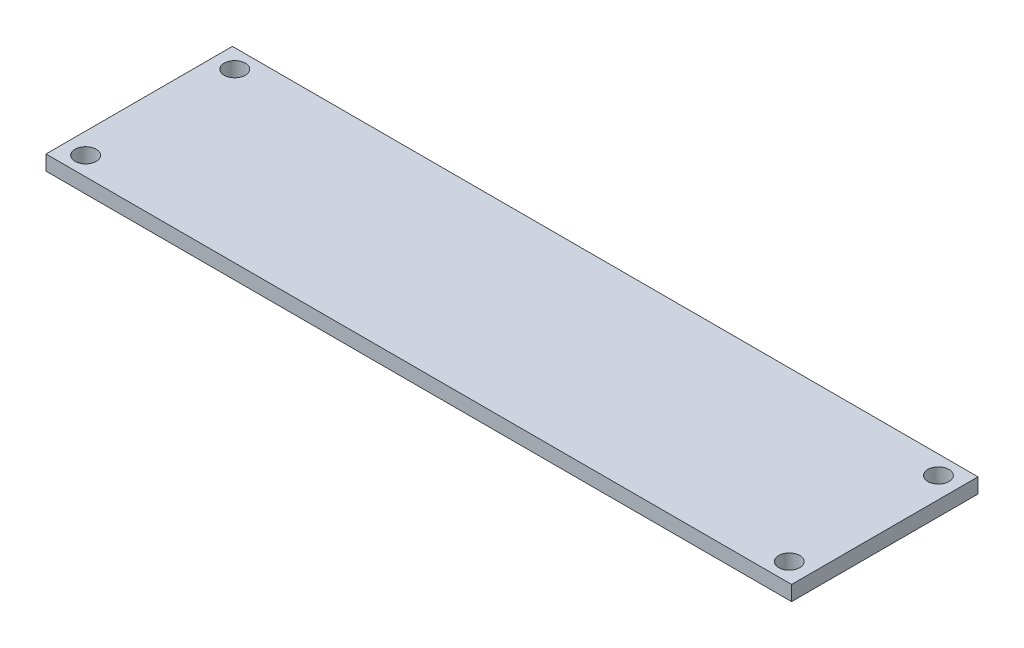
ISO-10303-21;
HEADER;
FILE_DESCRIPTION(('STEP AP214'),'2;1');
FILE_NAME('part.step','',(''),(''),'','','');
FILE_SCHEMA(('AUTOMOTIVE_DESIGN { 1 0 10303 214 1 1 1 1 }'));
ENDSEC;
DATA;
#1=APPLICATION_CONTEXT('core data for automotive mechanical design processes');
#2=APPLICATION_PROTOCOL_DEFINITION('international standard','automotive_design',2000,#1);
#3=PRODUCT_CONTEXT('',#1,'mechanical');
#4=PRODUCT('Part','Part','',(#3));
#5=PRODUCT_RELATED_PRODUCT_CATEGORY('part','',(#4));
#6=PRODUCT_DEFINITION_FORMATION('','',#4);
#7=PRODUCT_DEFINITION_CONTEXT('part definition',#1,'design');
#8=PRODUCT_DEFINITION('design','',#6,#7);
#9=PRODUCT_DEFINITION_SHAPE('','',#8);
#10=(LENGTH_UNIT() NAMED_UNIT(*) SI_UNIT(.MILLI.,.METRE.));
#11=(NAMED_UNIT(*) PLANE_ANGLE_UNIT() SI_UNIT($,.RADIAN.));
#12=(NAMED_UNIT(*) SI_UNIT($,.STERADIAN.) SOLID_ANGLE_UNIT());
#13=UNCERTAINTY_MEASURE_WITH_UNIT(LENGTH_MEASURE(1.E-05),#10,'distance_accuracy_value','');
#14=(GEOMETRIC_REPRESENTATION_CONTEXT(3) GLOBAL_UNCERTAINTY_ASSIGNED_CONTEXT((#13)) GLOBAL_UNIT_ASSIGNED_CONTEXT((#10,
#11,#12)) REPRESENTATION_CONTEXT('',''));
#15=CARTESIAN_POINT('',(0.,0.,0.));
#16=DIRECTION('',(0.,0.,1.));
#17=DIRECTION('',(1.,0.,0.));
#18=AXIS2_PLACEMENT_3D('',#15,#16,#17);
#19=CARTESIAN_POINT('',(0.,1.6,0.));
#20=DIRECTION('',(0.,-1.,0.));
#21=DIRECTION('',(0.,0.,-1.));
#22=AXIS2_PLACEMENT_3D('',#19,#20,#21);
#23=PLANE('',#22);
#24=DIRECTION('',(0.,0.,1.));
#25=VECTOR('',#24,1.);
#26=CARTESIAN_POINT('',(0.,1.6,0.));
#27=LINE('',#26,#25);
#28=CARTESIAN_POINT('',(0.,1.6,-20.));
#29=VERTEX_POINT('',#28);
#30=CARTESIAN_POINT('',(0.,1.6,0.));
#31=VERTEX_POINT('',#30);
#32=EDGE_CURVE('E87',#29,#31,#27,.T.);
#33=ORIENTED_EDGE('',*,*,#32,.T.);
#34=DIRECTION('',(1.,0.,0.));
#35=VECTOR('',#34,1.);
#36=CARTESIAN_POINT('',(0.,1.6,0.));
#37=LINE('',#36,#35);
#38=CARTESIAN_POINT('',(80.,1.6,0.));
#39=VERTEX_POINT('',#38);
#40=EDGE_CURVE('E82',#31,#39,#37,.T.);
#41=ORIENTED_EDGE('',*,*,#40,.T.);
#42=DIRECTION('',(0.,0.,-1.));
#43=VECTOR('',#42,1.);
#44=CARTESIAN_POINT('',(80.,1.6,0.));
#45=LINE('',#44,#43);
#46=CARTESIAN_POINT('',(80.,1.6,-20.));
#47=VERTEX_POINT('',#46);
#48=EDGE_CURVE('E85',#39,#47,#45,.T.);
#49=ORIENTED_EDGE('',*,*,#48,.T.);
#50=DIRECTION('',(-1.,0.,0.));
#51=VECTOR('',#50,1.);
#52=CARTESIAN_POINT('',(0.,1.6,-20.));
#53=LINE('',#52,#51);
#54=EDGE_CURVE('E52',#47,#29,#53,.T.);
#55=ORIENTED_EDGE('',*,*,#54,.T.);
#56=EDGE_LOOP('',(#33,#41,#49,#55));
#57=FACE_BOUND('',#56,.T.);
#58=CARTESIAN_POINT('',(2.25,1.6,-18.));
#59=DIRECTION('',(0.,1.,0.));
#60=DIRECTION('',(0.,0.,1.));
#61=AXIS2_PLACEMENT_3D('',#58,#59,#60);
#62=CIRCLE('',#61,1.13302148548641);
#63=CARTESIAN_POINT('',(2.25,1.6,-16.8669785145136));
#64=VERTEX_POINT('',#63);
#65=EDGE_CURVE('E102',#64,#64,#62,.T.);
#66=ORIENTED_EDGE('',*,*,#65,.F.);
#67=EDGE_LOOP('',(#66));
#68=FACE_BOUND('',#67,.T.);
#69=CARTESIAN_POINT('',(77.75,1.6,-18.));
#70=DIRECTION('',(0.,1.,0.));
#71=DIRECTION('',(0.,0.,-1.));
#72=AXIS2_PLACEMENT_3D('',#69,#70,#71);
#73=CIRCLE('',#72,1.13302148548642);
#74=CARTESIAN_POINT('',(77.75,1.6,-19.1330214854864));
#75=VERTEX_POINT('',#74);
#76=EDGE_CURVE('E117',#75,#75,#73,.T.);
#77=ORIENTED_EDGE('',*,*,#76,.F.);
#78=EDGE_LOOP('',(#77));
#79=FACE_BOUND('',#78,.T.);
#80=CARTESIAN_POINT('',(77.75,1.6,-2.));
#81=DIRECTION('',(0.,1.,0.));
#82=DIRECTION('',(0.,0.,1.));
#83=AXIS2_PLACEMENT_3D('',#80,#81,#82);
#84=CIRCLE('',#83,1.13302148548642);
#85=CARTESIAN_POINT('',(77.75,1.6,-0.866978514513583));
#86=VERTEX_POINT('',#85);
#87=EDGE_CURVE('E123',#86,#86,#84,.T.);
#88=ORIENTED_EDGE('',*,*,#87,.F.);
#89=EDGE_LOOP('',(#88));
#90=FACE_BOUND('',#89,.T.);
#91=CARTESIAN_POINT('',(2.25,1.6,-2.));
#92=DIRECTION('',(0.,1.,0.));
#93=DIRECTION('',(0.,0.,-1.));
#94=AXIS2_PLACEMENT_3D('',#91,#92,#93);
#95=CIRCLE('',#94,1.13302148548641);
#96=CARTESIAN_POINT('',(2.25,1.6,-3.13302148548641));
#97=VERTEX_POINT('',#96);
#98=EDGE_CURVE('E129',#97,#97,#95,.T.);
#99=ORIENTED_EDGE('',*,*,#98,.F.);
#100=EDGE_LOOP('',(#99));
#101=FACE_BOUND('',#100,.T.);
#102=ADVANCED_FACE('F35',(#57,#68,#79,#90,#101),#23,.F.);
#103=CARTESIAN_POINT('',(0.,0.,0.));
#104=DIRECTION('',(0.,-1.,0.));
#105=DIRECTION('',(0.,0.,-1.));
#106=AXIS2_PLACEMENT_3D('',#103,#104,#105);
#107=PLANE('',#106);
#108=CARTESIAN_POINT('',(77.75,0.,-2.));
#109=DIRECTION('',(0.,1.,0.));
#110=DIRECTION('',(0.,0.,1.));
#111=AXIS2_PLACEMENT_3D('',#108,#109,#110);
#112=CIRCLE('',#111,1.13302148548642);
#113=CARTESIAN_POINT('',(77.75,0.,-0.866978514513583));
#114=VERTEX_POINT('',#113);
#115=EDGE_CURVE('E126',#114,#114,#112,.T.);
#116=ORIENTED_EDGE('',*,*,#115,.T.);
#117=EDGE_LOOP('',(#116));
#118=FACE_BOUND('',#117,.T.);
#119=CARTESIAN_POINT('',(2.25,0.,-18.));
#120=DIRECTION('',(0.,1.,0.));
#121=DIRECTION('',(0.,0.,1.));
#122=AXIS2_PLACEMENT_3D('',#119,#120,#121);
#123=CIRCLE('',#122,1.13302148548641);
#124=CARTESIAN_POINT('',(2.25,0.,-16.8669785145136));
#125=VERTEX_POINT('',#124);
#126=EDGE_CURVE('E114',#125,#125,#123,.T.);
#127=ORIENTED_EDGE('',*,*,#126,.T.);
#128=EDGE_LOOP('',(#127));
#129=FACE_BOUND('',#128,.T.);
#130=DIRECTION('',(0.,0.,1.));
#131=VECTOR('',#130,1.);
#132=CARTESIAN_POINT('',(0.,0.,0.));
#133=LINE('',#132,#131);
#134=CARTESIAN_POINT('',(0.,0.,-20.));
#135=VERTEX_POINT('',#134);
#136=CARTESIAN_POINT('',(0.,0.,0.));
#137=VERTEX_POINT('',#136);
#138=EDGE_CURVE('E99',#135,#137,#133,.T.);
#139=ORIENTED_EDGE('',*,*,#138,.F.);
#140=DIRECTION('',(-1.,0.,0.));
#141=VECTOR('',#140,1.);
#142=CARTESIAN_POINT('',(0.,0.,-20.));
#143=LINE('',#142,#141);
#144=CARTESIAN_POINT('',(80.,0.,-20.));
#145=VERTEX_POINT('',#144);
#146=EDGE_CURVE('E75',#145,#135,#143,.T.);
#147=ORIENTED_EDGE('',*,*,#146,.F.);
#148=DIRECTION('',(0.,0.,-1.));
#149=VECTOR('',#148,1.);
#150=CARTESIAN_POINT('',(80.,0.,0.));
#151=LINE('',#150,#149);
#152=CARTESIAN_POINT('',(80.,0.,0.));
#153=VERTEX_POINT('',#152);
#154=EDGE_CURVE('E69',#153,#145,#151,.T.);
#155=ORIENTED_EDGE('',*,*,#154,.F.);
#156=DIRECTION('',(1.,0.,0.));
#157=VECTOR('',#156,1.);
#158=CARTESIAN_POINT('',(0.,0.,0.));
#159=LINE('',#158,#157);
#160=EDGE_CURVE('E91',#137,#153,#159,.T.);
#161=ORIENTED_EDGE('',*,*,#160,.F.);
#162=EDGE_LOOP('',(#139,#147,#155,#161));
#163=FACE_BOUND('',#162,.T.);
#164=CARTESIAN_POINT('',(77.75,0.,-18.));
#165=DIRECTION('',(0.,1.,0.));
#166=DIRECTION('',(0.,0.,-1.));
#167=AXIS2_PLACEMENT_3D('',#164,#165,#166);
#168=CIRCLE('',#167,1.13302148548642);
#169=CARTESIAN_POINT('',(77.75,0.,-19.1330214854864));
#170=VERTEX_POINT('',#169);
#171=EDGE_CURVE('E120',#170,#170,#168,.T.);
#172=ORIENTED_EDGE('',*,*,#171,.T.);
#173=EDGE_LOOP('',(#172));
#174=FACE_BOUND('',#173,.T.);
#175=CARTESIAN_POINT('',(2.25,0.,-2.));
#176=DIRECTION('',(0.,1.,0.));
#177=DIRECTION('',(0.,0.,-1.));
#178=AXIS2_PLACEMENT_3D('',#175,#176,#177);
#179=CIRCLE('',#178,1.13302148548641);
#180=CARTESIAN_POINT('',(2.25,0.,-3.13302148548641));
#181=VERTEX_POINT('',#180);
#182=EDGE_CURVE('E132',#181,#181,#179,.T.);
#183=ORIENTED_EDGE('',*,*,#182,.T.);
#184=EDGE_LOOP('',(#183));
#185=FACE_BOUND('',#184,.T.);
#186=ADVANCED_FACE('F110',(#118,#129,#163,#174,#185),#107,.T.);
#187=CARTESIAN_POINT('',(0.,1.6,0.));
#188=DIRECTION('',(1.,0.,0.));
#189=DIRECTION('',(0.,0.,-1.));
#190=AXIS2_PLACEMENT_3D('',#187,#188,#189);
#191=PLANE('',#190);
#192=ORIENTED_EDGE('',*,*,#138,.T.);
#193=DIRECTION('',(0.,-1.,0.));
#194=VECTOR('',#193,1.);
#195=CARTESIAN_POINT('',(0.,1.6,0.));
#196=LINE('',#195,#194);
#197=EDGE_CURVE('E11',#31,#137,#196,.T.);
#198=ORIENTED_EDGE('',*,*,#197,.F.);
#199=ORIENTED_EDGE('',*,*,#32,.F.);
#200=DIRECTION('',(0.,-1.,0.));
#201=VECTOR('',#200,1.);
#202=CARTESIAN_POINT('',(0.,1.6,-20.));
#203=LINE('',#202,#201);
#204=EDGE_CURVE('E95',#29,#135,#203,.T.);
#205=ORIENTED_EDGE('',*,*,#204,.T.);
#206=EDGE_LOOP('',(#192,#198,#199,#205));
#207=FACE_BOUND('',#206,.T.);
#208=ADVANCED_FACE('F37',(#207),#191,.F.);
#209=CARTESIAN_POINT('',(0.,1.6,0.));
#210=DIRECTION('',(0.,0.,-1.));
#211=DIRECTION('',(-1.,0.,0.));
#212=AXIS2_PLACEMENT_3D('',#209,#210,#211);
#213=PLANE('',#212);
#214=ORIENTED_EDGE('',*,*,#160,.T.);
#215=DIRECTION('',(0.,-1.,0.));
#216=VECTOR('',#215,1.);
#217=CARTESIAN_POINT('',(80.,1.6,0.));
#218=LINE('',#217,#216);
#219=EDGE_CURVE('E44',#39,#153,#218,.T.);
#220=ORIENTED_EDGE('',*,*,#219,.F.);
#221=ORIENTED_EDGE('',*,*,#40,.F.);
#222=ORIENTED_EDGE('',*,*,#197,.T.);
#223=EDGE_LOOP('',(#214,#220,#221,#222));
#224=FACE_BOUND('',#223,.T.);
#225=ADVANCED_FACE('F90',(#224),#213,.F.);
#226=CARTESIAN_POINT('',(80.,1.6,0.));
#227=DIRECTION('',(-1.,0.,0.));
#228=DIRECTION('',(0.,0.,1.));
#229=AXIS2_PLACEMENT_3D('',#226,#227,#228);
#230=PLANE('',#229);
#231=ORIENTED_EDGE('',*,*,#154,.T.);
#232=DIRECTION('',(0.,-1.,0.));
#233=VECTOR('',#232,1.);
#234=CARTESIAN_POINT('',(80.,1.6,-20.));
#235=LINE('',#234,#233);
#236=EDGE_CURVE('E92',#47,#145,#235,.T.);
#237=ORIENTED_EDGE('',*,*,#236,.F.);
#238=ORIENTED_EDGE('',*,*,#48,.F.);
#239=ORIENTED_EDGE('',*,*,#219,.T.);
#240=EDGE_LOOP('',(#231,#237,#238,#239));
#241=FACE_BOUND('',#240,.T.);
#242=ADVANCED_FACE('F93',(#241),#230,.F.);
#243=CARTESIAN_POINT('',(0.,1.6,-20.));
#244=DIRECTION('',(0.,0.,1.));
#245=DIRECTION('',(1.,0.,0.));
#246=AXIS2_PLACEMENT_3D('',#243,#244,#245);
#247=PLANE('',#246);
#248=ORIENTED_EDGE('',*,*,#146,.T.);
#249=ORIENTED_EDGE('',*,*,#204,.F.);
#250=ORIENTED_EDGE('',*,*,#54,.F.);
#251=ORIENTED_EDGE('',*,*,#236,.T.);
#252=EDGE_LOOP('',(#248,#249,#250,#251));
#253=FACE_BOUND('',#252,.T.);
#254=ADVANCED_FACE('F107',(#253),#247,.F.);
#255=CARTESIAN_POINT('',(2.25,1.6,-18.));
#256=DIRECTION('',(0.,-1.,0.));
#257=DIRECTION('',(0.,0.,-1.));
#258=AXIS2_PLACEMENT_3D('',#255,#256,#257);
#259=CYLINDRICAL_SURFACE('',#258,1.13302148548641);
#260=ORIENTED_EDGE('',*,*,#65,.T.);
#261=EDGE_LOOP('',(#260));
#262=FACE_BOUND('',#261,.T.);
#263=ORIENTED_EDGE('',*,*,#126,.F.);
#264=EDGE_LOOP('',(#263));
#265=FACE_BOUND('',#264,.T.);
#266=ADVANCED_FACE('F149',(#262,#265),#259,.F.);
#267=CARTESIAN_POINT('',(77.75,1.6,-18.));
#268=DIRECTION('',(0.,-1.,0.));
#269=DIRECTION('',(0.,0.,-1.));
#270=AXIS2_PLACEMENT_3D('',#267,#268,#269);
#271=CYLINDRICAL_SURFACE('',#270,1.13302148548642);
#272=ORIENTED_EDGE('',*,*,#76,.T.);
#273=EDGE_LOOP('',(#272));
#274=FACE_BOUND('',#273,.T.);
#275=ORIENTED_EDGE('',*,*,#171,.F.);
#276=EDGE_LOOP('',(#275));
#277=FACE_BOUND('',#276,.T.);
#278=ADVANCED_FACE('F195',(#274,#277),#271,.F.);
#279=CARTESIAN_POINT('',(77.75,1.6,-2.));
#280=DIRECTION('',(0.,-1.,0.));
#281=DIRECTION('',(0.,0.,-1.));
#282=AXIS2_PLACEMENT_3D('',#279,#280,#281);
#283=CYLINDRICAL_SURFACE('',#282,1.13302148548642);
#284=ORIENTED_EDGE('',*,*,#87,.T.);
#285=EDGE_LOOP('',(#284));
#286=FACE_BOUND('',#285,.T.);
#287=ORIENTED_EDGE('',*,*,#115,.F.);
#288=EDGE_LOOP('',(#287));
#289=FACE_BOUND('',#288,.T.);
#290=ADVANCED_FACE('F203',(#286,#289),#283,.F.);
#291=CARTESIAN_POINT('',(2.25,1.6,-2.));
#292=DIRECTION('',(0.,-1.,0.));
#293=DIRECTION('',(0.,0.,-1.));
#294=AXIS2_PLACEMENT_3D('',#291,#292,#293);
#295=CYLINDRICAL_SURFACE('',#294,1.13302148548641);
#296=ORIENTED_EDGE('',*,*,#98,.T.);
#297=EDGE_LOOP('',(#296));
#298=FACE_BOUND('',#297,.T.);
#299=ORIENTED_EDGE('',*,*,#182,.F.);
#300=EDGE_LOOP('',(#299));
#301=FACE_BOUND('',#300,.T.);
#302=ADVANCED_FACE('F138',(#298,#301),#295,.F.);
#303=CLOSED_SHELL('',(#102,#186,#208,#225,#242,#254,#266,#278,#290,#302));
#304=MANIFOLD_SOLID_BREP('B2',#303);
#305=ADVANCED_BREP_SHAPE_REPRESENTATION('',(#18,#304),#14);
#306=SHAPE_DEFINITION_REPRESENTATION(#9,#305);
ENDSEC;
END-ISO-10303-21;
